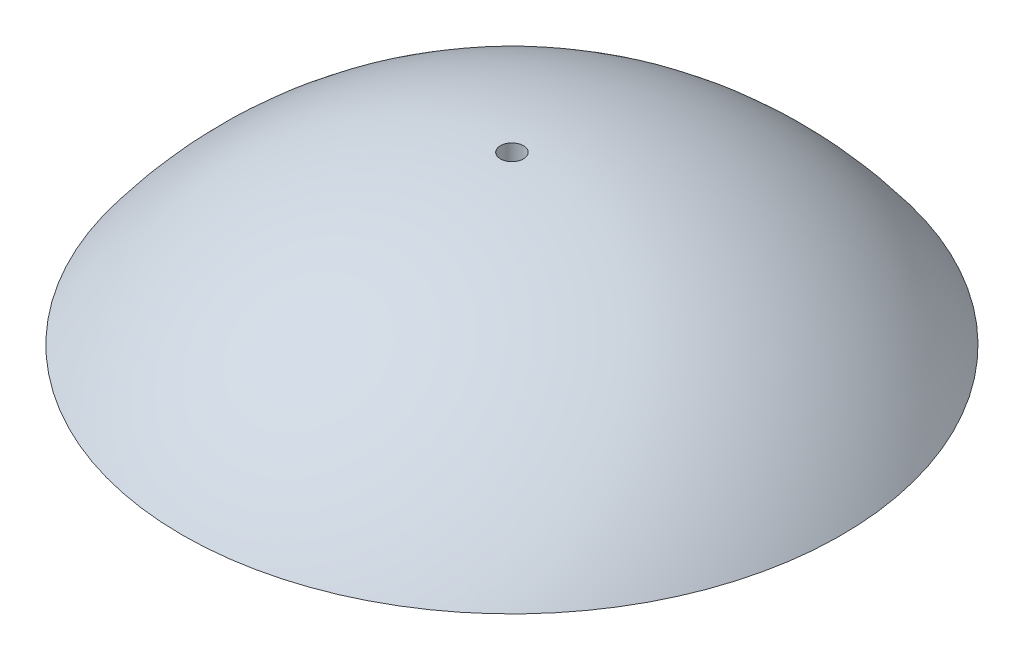
ISO-10303-21;
HEADER;
FILE_DESCRIPTION(('STEP AP214'),'2;1');
FILE_NAME('part.step','',(''),(''),'','','');
FILE_SCHEMA(('AUTOMOTIVE_DESIGN { 1 0 10303 214 1 1 1 1 }'));
ENDSEC;
DATA;
#1=APPLICATION_CONTEXT('core data for automotive mechanical design processes');
#2=APPLICATION_PROTOCOL_DEFINITION('international standard','automotive_design',2000,#1);
#3=PRODUCT_CONTEXT('',#1,'mechanical');
#4=PRODUCT('Part','Part','',(#3));
#5=PRODUCT_RELATED_PRODUCT_CATEGORY('part','',(#4));
#6=PRODUCT_DEFINITION_FORMATION('','',#4);
#7=PRODUCT_DEFINITION_CONTEXT('part definition',#1,'design');
#8=PRODUCT_DEFINITION('design','',#6,#7);
#9=PRODUCT_DEFINITION_SHAPE('','',#8);
#10=(LENGTH_UNIT() NAMED_UNIT(*) SI_UNIT(.MILLI.,.METRE.));
#11=(NAMED_UNIT(*) PLANE_ANGLE_UNIT() SI_UNIT($,.RADIAN.));
#12=(NAMED_UNIT(*) SI_UNIT($,.STERADIAN.) SOLID_ANGLE_UNIT());
#13=UNCERTAINTY_MEASURE_WITH_UNIT(LENGTH_MEASURE(1.E-05),#10,'distance_accuracy_value','');
#14=(GEOMETRIC_REPRESENTATION_CONTEXT(3) GLOBAL_UNCERTAINTY_ASSIGNED_CONTEXT((#13)) GLOBAL_UNIT_ASSIGNED_CONTEXT((#10,
#11,#12)) REPRESENTATION_CONTEXT('',''));
#15=CARTESIAN_POINT('',(0.,0.,0.));
#16=DIRECTION('',(0.,0.,1.));
#17=DIRECTION('',(1.,0.,0.));
#18=AXIS2_PLACEMENT_3D('',#15,#16,#17);
#19=CARTESIAN_POINT('',(0.,0.,0.));
#20=DIRECTION('',(0.,-1.,0.));
#21=DIRECTION('',(0.,0.,-1.));
#22=AXIS2_PLACEMENT_3D('',#19,#20,#21);
#23=CYLINDRICAL_SURFACE('',#22,0.95);
#24=CARTESIAN_POINT('',(0.,20.,0.));
#25=DIRECTION('',(0.,-1.,0.));
#26=DIRECTION('',(0.,0.,-1.));
#27=AXIS2_PLACEMENT_3D('',#24,#25,#26);
#28=CIRCLE('',#27,0.949999999999999);
#29=CARTESIAN_POINT('',(0.,20.,-0.949999999999999));
#30=VERTEX_POINT('',#29);
#31=EDGE_CURVE('E47',#30,#30,#28,.T.);
#32=ORIENTED_EDGE('',*,*,#31,.T.);
#33=EDGE_LOOP('',(#32));
#34=FACE_BOUND('',#33,.T.);
#35=CARTESIAN_POINT('',(0.,33.7866467705808,0.));
#36=DIRECTION('',(0.,-1.,0.));
#37=DIRECTION('',(0.,0.,-1.));
#38=AXIS2_PLACEMENT_3D('',#35,#36,#37);
#39=CIRCLE('',#38,0.95);
#40=CARTESIAN_POINT('',(0.,33.7866467705808,0.949999999999947));
#41=VERTEX_POINT('',#40);
#42=EDGE_CURVE('E10',#41,#41,#39,.T.);
#43=ORIENTED_EDGE('',*,*,#42,.F.);
#44=EDGE_LOOP('',(#43));
#45=FACE_BOUND('',#44,.T.);
#46=ADVANCED_FACE('F37',(#34,#45),#23,.F.);
#47=CARTESIAN_POINT('',(0.,0.,0.));
#48=DIRECTION('',(0.,-1.,0.));
#49=DIRECTION('',(0.,0.,1.));
#50=AXIS2_PLACEMENT_3D('',#47,#48,#49);
#51=SPHERICAL_SURFACE('',#50,33.8);
#52=CARTESIAN_POINT('',(0.,20.,0.));
#53=DIRECTION('',(0.,-1.,0.));
#54=DIRECTION('',(0.,0.,-1.));
#55=AXIS2_PLACEMENT_3D('',#52,#53,#54);
#56=CIRCLE('',#55,27.2477522008697);
#57=CARTESIAN_POINT('',(0.,20.,27.2477522008697));
#58=VERTEX_POINT('',#57);
#59=EDGE_CURVE('E43',#58,#58,#56,.T.);
#60=CARTESIAN_POINT('',(0.,33.7866467705808,0.949999999999947));
#61=CARTESIAN_POINT('',(0.,33.7776478250587,1.27009346907175));
#62=CARTESIAN_POINT('',(0.,33.7640974616269,1.59005889811322));
#63=CARTESIAN_POINT('',(0.,33.7279106325553,2.22947555190177));
#64=CARTESIAN_POINT('',(0.,33.7052741669155,2.54892677664884));
#65=CARTESIAN_POINT('',(0.,33.6509318670394,3.18705689761485));
#66=CARTESIAN_POINT('',(0.,33.6192260328031,3.50573579383379));
#67=CARTESIAN_POINT('',(0.,33.5467710216776,4.1420638686497));
#68=CARTESIAN_POINT('',(0.,33.5060218447884,4.45971304724667));
#69=CARTESIAN_POINT('',(0.,33.4155129521158,5.09372509965772));
#70=CARTESIAN_POINT('',(0.,33.3657532363324,5.41008797347181));
#71=CARTESIAN_POINT('',(0.,33.2572634890777,6.04127187615818));
#72=CARTESIAN_POINT('',(0.,33.1985334576065,6.35609290503048));
#73=CARTESIAN_POINT('',(0.,33.0721505101152,6.98393882095734));
#74=CARTESIAN_POINT('',(0.,33.0044975940951,7.2969637080119));
#75=CARTESIAN_POINT('',(0.,32.8603235262348,7.92096449483307));
#76=CARTESIAN_POINT('',(0.,32.7838023743946,8.23194039459968));
#77=CARTESIAN_POINT('',(0.,32.6219536442168,8.85159201628879));
#78=CARTESIAN_POINT('',(0.,32.5366260658791,9.16026773821129));
#79=CARTESIAN_POINT('',(0.,32.3572334061402,9.77506967166395));
#80=CARTESIAN_POINT('',(0.,32.263168324739,10.0811958831941));
#81=CARTESIAN_POINT('',(0.,32.0663766398229,10.6906515226677));
#82=CARTESIAN_POINT('',(0.,31.9636500363081,10.9939809506111));
#83=CARTESIAN_POINT('',(0.,31.7496182845041,11.5975980088195));
#84=CARTESIAN_POINT('',(0.,31.638313136215,11.8978856390844));
#85=CARTESIAN_POINT('',(0.,31.4072142015001,12.4951765448526));
#86=CARTESIAN_POINT('',(0.,31.2874204150744,12.7921798203559));
#87=CARTESIAN_POINT('',(0.,31.0394409674184,13.3826621124529));
#88=CARTESIAN_POINT('',(0.,30.911255306188,13.6761411290466));
#89=CARTESIAN_POINT('',(0.,30.6465956507832,14.2593378458935));
#90=CARTESIAN_POINT('',(0.,30.5101216566089,14.5490555461466));
#91=CARTESIAN_POINT('',(0.,30.2289955720713,15.1244956110817));
#92=CARTESIAN_POINT('',(0.,30.084343481708,15.4102179757636));
#93=CARTESIAN_POINT('',(0.,29.7869780473979,15.9774365775543));
#94=CARTESIAN_POINT('',(0.,29.634264703451,16.2589328146632));
#95=CARTESIAN_POINT('',(0.,29.3209001160499,16.8174717829571));
#96=CARTESIAN_POINT('',(0.,29.1602488725957,17.0945145141422));
#97=CARTESIAN_POINT('',(0.,28.8311382520877,17.6439226895534));
#98=CARTESIAN_POINT('',(0.,28.662678875034,17.9162881337796));
#99=CARTESIAN_POINT('',(0.,28.3180880602484,18.4561217323129));
#100=CARTESIAN_POINT('',(0.,28.1419566225167,18.72358988662));
#101=CARTESIAN_POINT('',(0.,27.7821639563965,19.2534128581358));
#102=CARTESIAN_POINT('',(0.,27.598502728008,19.5157676753446));
#103=CARTESIAN_POINT('',(0.,27.2237988327805,20.0351520557813));
#104=CARTESIAN_POINT('',(0.,27.0327561659413,20.2921816190093));
#105=CARTESIAN_POINT('',(0.,26.6434437083603,20.8007078760605));
#106=CARTESIAN_POINT('',(0.,26.4451739176184,21.0522045698837));
#107=CARTESIAN_POINT('',(0.,26.0415673645154,21.5494619419131));
#108=CARTESIAN_POINT('',(0.,25.8362306021543,21.7952226201194));
#109=CARTESIAN_POINT('',(0.,25.4186559663166,22.2808094478105));
#110=CARTESIAN_POINT('',(0.,25.2064180928401,22.5206355972955));
#111=CARTESIAN_POINT('',(0.,24.7752126700902,22.9941596486254));
#112=CARTESIAN_POINT('',(0.,24.5562451208168,23.2278575504704));
#113=CARTESIAN_POINT('',(0.,24.1117572160103,23.6889363355422));
#114=CARTESIAN_POINT('',(0.,23.8862368604771,23.9163172187691));
#115=CARTESIAN_POINT('',(0.,23.4288255119498,24.3645783062039));
#116=CARTESIAN_POINT('',(0.,23.1969345189557,24.5854585104119));
#117=CARTESIAN_POINT('',(0.,22.7269691869018,25.0205398004287));
#118=CARTESIAN_POINT('',(0.,22.4888948478419,25.2347408862376));
#119=CARTESIAN_POINT('',(0.,22.0067551965297,25.656291006708));
#120=CARTESIAN_POINT('',(0.,21.7626898842773,25.8636400413696));
#121=CARTESIAN_POINT('',(0.,21.2687651743958,26.2713182451141));
#122=CARTESIAN_POINT('',(0.,21.0189057767667,26.4716474141971));
#123=CARTESIAN_POINT('',(0.,20.5135956742738,26.8651252967509));
#124=CARTESIAN_POINT('',(0.,20.25814496941,27.0582740102217));
#125=CARTESIAN_POINT('',(0.,20.,27.2477522008697));
#126=B_SPLINE_CURVE_WITH_KNOTS('',3,(#60,#61,#62,#63,#64,#65,#66,#67,#68,#69,#70,#71,#72,#73,
#74,#75,#76,#77,#78,#79,#80,#81,#82,#83,#84,#85,#86,#87,#88,#89,#90,#91,#92,#93,#94,#95,#96,#97,
#98,#99,#100,#101,#102,#103,#104,#105,#106,#107,#108,#109,#110,#111,#112,#113,#114,#115,#116,
#117,#118,#119,#120,#121,#122,#123,#124,#125),.UNSPECIFIED.,.F.,.F.,(4,2,2,2,2,2,2,2,2,2,2,2,2,
2,2,2,2,2,2,2,2,2,2,2,2,2,2,2,2,2,2,2,4),(0.,0.960627376859183,1.92125475371837,
2.88188213057755,3.84250950743673,4.80313688429591,5.76376426115509,6.72439163801427,
7.68501901487345,8.64564639173264,9.60627376859182,10.566901145451,11.5275285223102,
12.4881558991694,13.4487832760285,14.4094106528877,15.3700380297469,16.3306654066061,
17.2912927834653,18.2519201603245,19.2125475371836,20.1731749140428,21.133802290902,
22.0944296677612,23.0550570446204,24.0156844214795,24.9763117983387,25.9369391751979,
26.8975665520571,27.8581939289163,28.8188213057754,29.7794486826346,30.7400760594938),.UNSPECIFIED.);
#127=EDGE_CURVE('BSEAM58',#41,#58,#126,.T.);
#128=ORIENTED_EDGE('',*,*,#42,.T.);
#129=ORIENTED_EDGE('',*,*,#59,.F.);
#130=ORIENTED_EDGE('',*,*,#127,.T.);
#131=ORIENTED_EDGE('',*,*,#127,.F.);
#132=EDGE_LOOP('',(#128,#130,#129,#131));
#133=FACE_BOUND('',#132,.T.);
#134=ADVANCED_FACE('F58',(#133),#51,.T.);
#135=CARTESIAN_POINT('',(0.,20.,0.));
#136=DIRECTION('',(0.,1.,0.));
#137=DIRECTION('',(0.,0.,1.));
#138=AXIS2_PLACEMENT_3D('',#135,#136,#137);
#139=PLANE('',#138);
#140=ORIENTED_EDGE('',*,*,#31,.F.);
#141=EDGE_LOOP('',(#140));
#142=FACE_BOUND('',#141,.T.);
#143=ORIENTED_EDGE('',*,*,#59,.T.);
#144=EDGE_LOOP('',(#143));
#145=FACE_BOUND('',#144,.T.);
#146=ADVANCED_FACE('F56',(#142,#145),#139,.F.);
#147=CLOSED_SHELL('',(#46,#134,#146));
#148=MANIFOLD_SOLID_BREP('B2',#147);
#149=ADVANCED_BREP_SHAPE_REPRESENTATION('',(#18,#148),#14);
#150=SHAPE_DEFINITION_REPRESENTATION(#9,#149);
ENDSEC;
END-ISO-10303-21;
